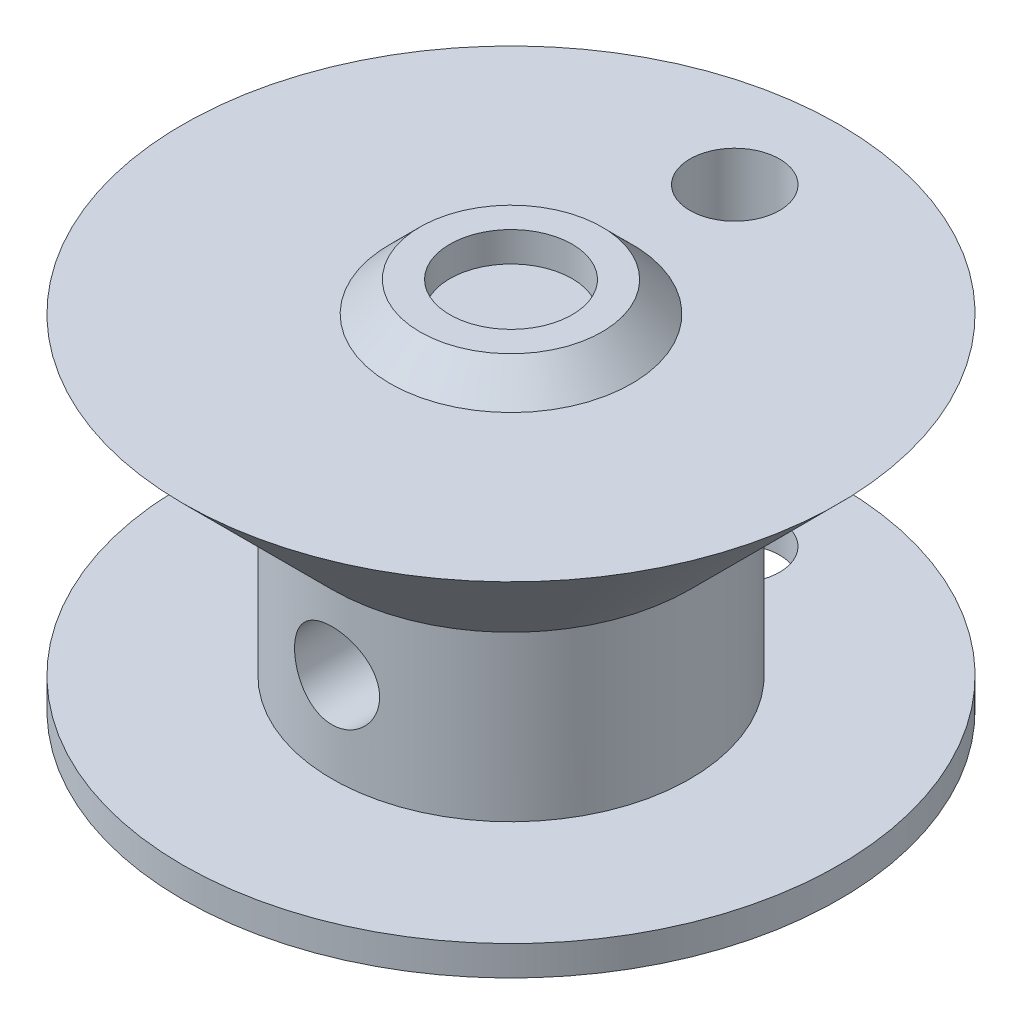
ISO-10303-21;
HEADER;
FILE_DESCRIPTION(('STEP AP214'),'2;1');
FILE_NAME('part.step','',(''),(''),'','','');
FILE_SCHEMA(('AUTOMOTIVE_DESIGN { 1 0 10303 214 1 1 1 1 }'));
ENDSEC;
DATA;
#1=APPLICATION_CONTEXT('core data for automotive mechanical design processes');
#2=APPLICATION_PROTOCOL_DEFINITION('international standard','automotive_design',2000,#1);
#3=PRODUCT_CONTEXT('',#1,'mechanical');
#4=PRODUCT('Part','Part','',(#3));
#5=PRODUCT_RELATED_PRODUCT_CATEGORY('part','',(#4));
#6=PRODUCT_DEFINITION_FORMATION('','',#4);
#7=PRODUCT_DEFINITION_CONTEXT('part definition',#1,'design');
#8=PRODUCT_DEFINITION('design','',#6,#7);
#9=PRODUCT_DEFINITION_SHAPE('','',#8);
#10=(LENGTH_UNIT() NAMED_UNIT(*) SI_UNIT(.MILLI.,.METRE.));
#11=(NAMED_UNIT(*) PLANE_ANGLE_UNIT() SI_UNIT($,.RADIAN.));
#12=(NAMED_UNIT(*) SI_UNIT($,.STERADIAN.) SOLID_ANGLE_UNIT());
#13=UNCERTAINTY_MEASURE_WITH_UNIT(LENGTH_MEASURE(1.E-05),#10,'distance_accuracy_value','');
#14=(GEOMETRIC_REPRESENTATION_CONTEXT(3) GLOBAL_UNCERTAINTY_ASSIGNED_CONTEXT((#13)) GLOBAL_UNIT_ASSIGNED_CONTEXT((#10,
#11,#12)) REPRESENTATION_CONTEXT('',''));
#15=CARTESIAN_POINT('',(0.,0.,0.));
#16=DIRECTION('',(0.,0.,1.));
#17=DIRECTION('',(1.,0.,0.));
#18=AXIS2_PLACEMENT_3D('',#15,#16,#17);
#19=CARTESIAN_POINT('',(0.,-6.24999999999999,-7.5));
#20=DIRECTION('',(0.,1.,0.));
#21=DIRECTION('',(0.,0.,1.));
#22=AXIS2_PLACEMENT_3D('',#19,#20,#21);
#23=CYLINDRICAL_SURFACE('',#22,1.5);
#24=CARTESIAN_POINT('',(-1.26870488081761,2.64664434459369,-8.30024241663984));
#25=CARTESIAN_POINT('',(-1.32275027709685,2.57010996980888,-8.21456014107575));
#26=CARTESIAN_POINT('',(-1.36661427123205,2.48977946235469,-8.12580957644183));
#27=CARTESIAN_POINT('',(-1.43556861508778,2.32402530976454,-7.94553128783668));
#28=CARTESIAN_POINT('',(-1.46059999942973,2.23858656453833,-7.85399576719215));
#29=CARTESIAN_POINT('',(-1.4942810386583,2.05861159078597,-7.66438540690111));
#30=CARTESIAN_POINT('',(-1.50167214520486,1.96385565336773,-7.56629794717566));
#31=CARTESIAN_POINT('',(-1.49769646010133,1.77273200649526,-7.3721555025522));
#32=CARTESIAN_POINT('',(-1.48632198870708,1.67636365314342,-7.27610136607951));
#33=CARTESIAN_POINT('',(-1.44136326275431,1.46433888128269,-7.06889285227441));
#34=CARTESIAN_POINT('',(-1.40379527360432,1.34867605065692,-6.95855631309214));
#35=CARTESIAN_POINT('',(-1.32777047678987,1.17807901911149,-6.79966708387336));
#36=CARTESIAN_POINT('',(-1.29914550908919,1.1216896886689,-6.74780083952307));
#37=CARTESIAN_POINT('',(-1.23509860279238,1.01044951460901,-6.64670646867279));
#38=CARTESIAN_POINT('',(-1.19968071728378,0.955597775823249,-6.59747679132385));
#39=CARTESIAN_POINT('',(-1.11314269170065,0.836396158386069,-6.49175541165681));
#40=CARTESIAN_POINT('',(-1.06028236538606,0.77260272152475,-6.4360401296291));
#41=CARTESIAN_POINT('',(-0.943097883099595,0.650585750642468,-6.3309198778082));
#42=CARTESIAN_POINT('',(-0.878793020079254,0.592353092367532,-6.28150452468661));
#43=CARTESIAN_POINT('',(-0.75650047127398,0.49906139896352,-6.20327962694322));
#44=CARTESIAN_POINT('',(-0.701365247613398,0.461953713029618,-6.17248189479857));
#45=CARTESIAN_POINT('',(-0.584257625424888,0.394542057447988,-6.11695102903519));
#46=CARTESIAN_POINT('',(-0.52229590340861,0.364227682326575,-6.09220861491444));
#47=CARTESIAN_POINT('',(-0.406177715874166,0.318451672621708,-6.05504634401468));
#48=CARTESIAN_POINT('',(-0.353219440265773,0.301196824578154,-6.0411197832836));
#49=CARTESIAN_POINT('',(-0.244353603841997,0.27371677596157,-6.01899816561024));
#50=CARTESIAN_POINT('',(-0.188448958504836,0.263484761763993,-6.01079755316085));
#51=CARTESIAN_POINT('',(-0.0748651752631121,0.250979092118054,-6.00078050222282));
#52=CARTESIAN_POINT('',(-0.0171782724982462,0.248747429776086,-5.99899775028552));
#53=CARTESIAN_POINT('',(0.0977377785373782,0.252604786511167,-6.00208408371304));
#54=CARTESIAN_POINT('',(0.154966861760675,0.258694967562729,-6.00695409799999));
#55=CARTESIAN_POINT('',(0.262899564481382,0.277801744155363,-6.02228762699205));
#56=CARTESIAN_POINT('',(0.313769997322339,0.290262024070495,-6.03230215641292));
#57=CARTESIAN_POINT('',(0.412591119335264,0.320800698786422,-6.05695918614998));
#58=CARTESIAN_POINT('',(0.460540538205376,0.338881517301619,-6.07160368306852));
#59=CARTESIAN_POINT('',(0.576183603502633,0.389841139847715,-6.11311502864666));
#60=CARTESIAN_POINT('',(0.641730480997539,0.4255950468706,-6.14242920835007));
#61=CARTESIAN_POINT('',(0.764696200336753,0.504329872416751,-6.20767190625326));
#62=CARTESIAN_POINT('',(0.822093248199738,0.547329520653735,-6.24361758984829));
#63=CARTESIAN_POINT('',(0.955239472676363,0.660500989413758,-6.33933204884527));
#64=CARTESIAN_POINT('',(1.02622908443823,0.733674370238583,-6.40215227306974));
#65=CARTESIAN_POINT('',(1.15248143214062,0.886157472557447,-6.53551397281261));
#66=CARTESIAN_POINT('',(1.20771609827644,0.965477830113604,-6.60606892321955));
#67=CARTESIAN_POINT('',(1.32066703459271,1.15621820068893,-6.77892475952415));
#68=CARTESIAN_POINT('',(1.372338368965,1.26906030687446,-6.88362122892944));
#69=CARTESIAN_POINT('',(1.45028301900606,1.49669745037887,-7.10010691361249));
#70=CARTESIAN_POINT('',(1.47653225675623,1.61149423453783,-7.21190274632636));
#71=CARTESIAN_POINT('',(1.50329724119972,1.8411307826445,-7.44079704281348));
#72=CARTESIAN_POINT('',(1.50355618496891,1.95595976594491,-7.55793698295949));
#73=CARTESIAN_POINT('',(1.47585473872372,2.1813717876856,-7.79293428458994));
#74=CARTESIAN_POINT('',(1.44794113029228,2.29196154950744,-7.91079013478641));
#75=CARTESIAN_POINT('',(1.37398292405552,2.47354892317547,-8.10807229801833));
#76=CARTESIAN_POINT('',(1.33573647582947,2.54658704262582,-8.1885606141519));
#77=CARTESIAN_POINT('',(1.24267891629586,2.68680728048154,-8.34498890265467));
#78=CARTESIAN_POINT('',(1.18789118773595,2.75399749387767,-8.42093511534804));
#79=CARTESIAN_POINT('',(1.0749244800556,2.86599719997671,-8.54886595865352));
#80=CARTESIAN_POINT('',(1.02018847703524,2.9124665025473,-8.60243065473446));
#81=CARTESIAN_POINT('',(0.900006044458402,2.9987046523251,-8.70253204434571));
#82=CARTESIAN_POINT('',(0.834572677964975,3.03848155320884,-8.74907717816344));
#83=CARTESIAN_POINT('',(0.706264628113122,3.10304045247604,-8.82503151356365));
#84=CARTESIAN_POINT('',(0.645037687925222,3.12923237122943,-8.85601689345599));
#85=CARTESIAN_POINT('',(0.516687085002818,3.17464488396731,-8.90991795054105));
#86=CARTESIAN_POINT('',(0.449566313374303,3.19386887246678,-8.93283755691817));
#87=CARTESIAN_POINT('',(0.310589727379184,3.22435897068271,-8.96925874250693));
#88=CARTESIAN_POINT('',(0.23870776111016,3.23557631157473,-8.98270259842404));
#89=CARTESIAN_POINT('',(0.0929264122279952,3.24909503895602,-8.99891085464588));
#90=CARTESIAN_POINT('',(0.0190279881612712,3.25140058989522,-9.00168024309219));
#91=CARTESIAN_POINT('',(-0.120436862446871,3.24717846191059,-8.99661465715342));
#92=CARTESIAN_POINT('',(-0.186073694250374,3.24154073003508,-8.98984805460495));
#93=CARTESIAN_POINT('',(-0.314933280986468,3.22331621794359,-8.968021450791));
#94=CARTESIAN_POINT('',(-0.378156286918464,3.21073016235814,-8.95296231434219));
#95=CARTESIAN_POINT('',(-0.501202552691301,3.17912231987032,-8.91526508112846));
#96=CARTESIAN_POINT('',(-0.560991786054804,3.16004596042124,-8.89256273532595));
#97=CARTESIAN_POINT('',(-0.675543082484829,3.11632287250872,-8.84074689416931));
#98=CARTESIAN_POINT('',(-0.730301092470031,3.09167170744244,-8.81162829303646));
#99=CARTESIAN_POINT('',(-0.854113962432761,3.02728270448439,-8.73595339437538));
#100=CARTESIAN_POINT('',(-0.92058303727761,2.98538673742684,-8.6869949785194));
#101=CARTESIAN_POINT('',(-1.04205317521811,2.89471695153168,-8.58193849640474));
#102=CARTESIAN_POINT('',(-1.09704935890167,2.845940221033,-8.52583740864048));
#103=CARTESIAN_POINT('',(-1.19187910226939,2.7472951277001,-8.41345191717882));
#104=CARTESIAN_POINT('',(-1.23256794247262,2.69781832375337,-8.35753305233655));
#105=CARTESIAN_POINT('',(-1.26870488081761,2.64664434459369,-8.30024241663984));
#106=B_SPLINE_CURVE_WITH_KNOTS('',3,(#24,#25,#26,#27,#28,#29,#30,#31,#32,#33,#34,#35,#36,#37,
#38,#39,#40,#41,#42,#43,#44,#45,#46,#47,#48,#49,#50,#51,#52,#53,#54,#55,#56,#57,#58,#59,#60,#61,
#62,#63,#64,#65,#66,#67,#68,#69,#70,#71,#72,#73,#74,#75,#76,#77,#78,#79,#80,#81,#82,#83,#84,#85,
#86,#87,#88,#89,#90,#91,#92,#93,#94,#95,#96,#97,#98,#99,#100,#101,#102,#103,#104,#105),
.UNSPECIFIED.,.T.,.F.,(4,2,2,2,2,2,2,2,2,2,2,2,2,2,2,2,2,2,2,2,2,2,2,2,2,2,2,2,2,2,2,2,2,2,2,2,
2,2,2,2,4),(0.,0.380592259301111,0.762371259474062,1.17066679694771,1.57912946932966,
2.06920967256334,2.3143079758544,2.55926049029338,2.85795509268234,3.15615085112281,
3.37520986109037,3.59393100423957,3.76548645441234,3.93687522357175,4.10916229002464,
4.28147341528623,4.44080457574636,4.60020453925544,4.8394823257887,5.07938839242926,
5.4366651215128,5.79457447259401,6.27919972264892,6.76428352610846,7.25415984166957,
7.74322403536123,8.08772712493193,8.43174548724646,8.69951647636424,8.96696288698869,
9.18641867477447,9.40576740775859,9.62644105837053,9.84701157644085,10.0447423446333,
10.2424524956668,10.4418679173757,10.6414426020434,10.9176638754004,11.1940023870322,
11.4484817683634),.UNSPECIFIED.);
#107=CARTESIAN_POINT('',(0.,0.249999999999945,-6.));
#108=VERTEX_POINT('',#107);
#109=EDGE_CURVE('E64',#108,#108,#106,.T.);
#110=ORIENTED_EDGE('',*,*,#109,.F.);
#111=EDGE_LOOP('',(#110));
#112=FACE_BOUND('',#111,.T.);
#113=CARTESIAN_POINT('',(0.,5.25,-7.5));
#114=DIRECTION('',(0.,1.,0.));
#115=DIRECTION('',(0.,0.,1.));
#116=AXIS2_PLACEMENT_3D('',#113,#114,#115);
#117=CIRCLE('',#116,1.5);
#118=CARTESIAN_POINT('',(0.,5.25,-6.));
#119=VERTEX_POINT('',#118);
#120=EDGE_CURVE('E123',#119,#119,#117,.F.);
#121=ORIENTED_EDGE('',*,*,#120,.F.);
#122=EDGE_LOOP('',(#121));
#123=FACE_BOUND('',#122,.T.);
#124=ADVANCED_FACE('F41',(#112,#123),#23,.F.);
#125=CARTESIAN_POINT('',(0.,5.25,0.));
#126=DIRECTION('',(0.,1.,0.));
#127=DIRECTION('',(0.,0.,1.));
#128=AXIS2_PLACEMENT_3D('',#125,#126,#127);
#129=CONICAL_SURFACE('',#128,11.,0.785398163397443);
#130=CARTESIAN_POINT('',(0.,0.249999999999945,0.));
#131=DIRECTION('',(0.,-1.,0.));
#132=DIRECTION('',(0.,0.,-1.));
#133=AXIS2_PLACEMENT_3D('',#130,#131,#132);
#134=CIRCLE('',#133,6.);
#135=EDGE_CURVE('E178',#108,#108,#134,.T.);
#136=ORIENTED_EDGE('',*,*,#135,.F.);
#137=ORIENTED_EDGE('',*,*,#109,.T.);
#138=EDGE_LOOP('',(#136,#137));
#139=FACE_BOUND('',#138,.T.);
#140=CARTESIAN_POINT('',(0.,5.24999999999999,0.));
#141=DIRECTION('',(0.,1.,0.));
#142=DIRECTION('',(0.,0.,1.));
#143=AXIS2_PLACEMENT_3D('',#140,#141,#142);
#144=CIRCLE('',#143,11.);
#145=CARTESIAN_POINT('',(0.,5.24999999999999,11.));
#146=VERTEX_POINT('',#145);
#147=EDGE_CURVE('E119',#146,#146,#144,.T.);
#148=ORIENTED_EDGE('',*,*,#147,.F.);
#149=EDGE_LOOP('',(#148));
#150=FACE_BOUND('',#149,.T.);
#151=ADVANCED_FACE('F150',(#139,#150),#129,.T.);
#152=CARTESIAN_POINT('',(0.,0.,0.));
#153=DIRECTION('',(0.,-1.,0.));
#154=DIRECTION('',(0.,0.,-1.));
#155=AXIS2_PLACEMENT_3D('',#152,#153,#154);
#156=CYLINDRICAL_SURFACE('',#155,6.);
#157=CARTESIAN_POINT('',(-1.425,-2.24999999999999,5.82832523114488));
#158=CARTESIAN_POINT('',(-1.42499754957619,-2.17117794111468,5.82832679456273));
#159=CARTESIAN_POINT('',(-1.4184378215098,-2.09232784081619,5.8299416549799));
#160=CARTESIAN_POINT('',(-1.39240856638387,-1.93688283008329,5.83621206316854));
#161=CARTESIAN_POINT('',(-1.37293077688578,-1.86028939578861,5.84086955699068));
#162=CARTESIAN_POINT('',(-1.3217239026565,-1.71162862093966,5.85266866593076));
#163=CARTESIAN_POINT('',(-1.29000964313047,-1.63955592561644,5.85980727399827));
#164=CARTESIAN_POINT('',(-1.2152741852674,-1.50174876665406,5.87576058358233));
#165=CARTESIAN_POINT('',(-1.1722527981629,-1.43601440885566,5.8845753130803));
#166=CARTESIAN_POINT('',(-1.07521152025432,-1.31144284368174,5.90308368584141));
#167=CARTESIAN_POINT('',(-1.02100856102342,-1.25275013738443,5.91279023612396));
#168=CARTESIAN_POINT('',(-0.903537466038936,-1.14519786757853,5.93187618342717));
#169=CARTESIAN_POINT('',(-0.840268545152597,-1.09633915659828,5.9412555520256));
#170=CARTESIAN_POINT('',(-0.705480224711474,-1.00925868531205,5.95877223244116));
#171=CARTESIAN_POINT('',(-0.633867502858193,-0.971177658155908,5.96689253595175));
#172=CARTESIAN_POINT('',(-0.485032922332117,-0.907646682120866,5.98082949973903));
#173=CARTESIAN_POINT('',(-0.40781180994908,-0.882195056207134,5.9866464658509));
#174=CARTESIAN_POINT('',(-0.251457394902446,-0.845104755455634,5.99523011087759));
#175=CARTESIAN_POINT('',(-0.172385244024105,-0.833221017594805,5.99805084031474));
#176=CARTESIAN_POINT('',(-0.0133227060721131,-0.822835846943137,6.00051209689845));
#177=CARTESIAN_POINT('',(0.066667556540959,-0.824332621177975,6.00015305013169));
#178=CARTESIAN_POINT('',(0.223600311847056,-0.840487129989935,5.99633589030348));
#179=CARTESIAN_POINT('',(0.300571757474747,-0.854880504697239,5.99294002981346));
#180=CARTESIAN_POINT('',(0.450974185407286,-0.895996235816391,5.98350262636849));
#181=CARTESIAN_POINT('',(0.524404989940588,-0.922719210572902,5.97746095072343));
#182=CARTESIAN_POINT('',(0.666353632274086,-0.98795764626664,5.96331349407922));
#183=CARTESIAN_POINT('',(0.7348253277587,-1.02656970991081,5.95519089927642));
#184=CARTESIAN_POINT('',(0.864411622860792,-1.11441753547486,5.93776673030385));
#185=CARTESIAN_POINT('',(0.925525053314481,-1.16365498221359,5.92846496925563));
#186=CARTESIAN_POINT('',(1.04023513517472,-1.27278244311827,5.90943134397237));
#187=CARTESIAN_POINT('',(1.0936112232232,-1.33290367000971,5.89969452491111));
#188=CARTESIAN_POINT('',(1.18956960142804,-1.46134566768673,5.88109854367104));
#189=CARTESIAN_POINT('',(1.23215148268538,-1.52966674894938,5.87223941474805));
#190=CARTESIAN_POINT('',(1.30543564121244,-1.67296989418144,5.85638589540492));
#191=CARTESIAN_POINT('',(1.33608959815281,-1.7479775692796,5.84939912478785));
#192=CARTESIAN_POINT('',(1.38428698892714,-1.90228645669022,5.8381819440304));
#193=CARTESIAN_POINT('',(1.40183292150916,-1.98158684760096,5.83395100857215));
#194=CARTESIAN_POINT('',(1.42296022511067,-2.14019707641701,5.82883355152234));
#195=CARTESIAN_POINT('',(1.42686565223275,-2.21946129707896,5.82786943727281));
#196=CARTESIAN_POINT('',(1.42148419611726,-2.37750850010429,5.82918435723626));
#197=CARTESIAN_POINT('',(1.41219839709507,-2.45629152148399,5.8314631249098));
#198=CARTESIAN_POINT('',(1.38098102911739,-2.60996807984924,5.83893313640274));
#199=CARTESIAN_POINT('',(1.35923386623355,-2.68490133676671,5.84408188006119));
#200=CARTESIAN_POINT('',(1.30391354344055,-2.83005968451581,5.85667219311371));
#201=CARTESIAN_POINT('',(1.27033909049535,-2.90028425956417,5.86411401319062));
#202=CARTESIAN_POINT('',(1.19162428403317,-3.03541705838874,5.8806182798807));
#203=CARTESIAN_POINT('',(1.14628774384152,-3.10020768330397,5.88970734012212));
#204=CARTESIAN_POINT('',(1.04558730851077,-3.22138056747636,5.90841470344032));
#205=CARTESIAN_POINT('',(0.990221933262647,-3.27776158335589,5.91803308449101));
#206=CARTESIAN_POINT('',(0.869556752398671,-3.38180463928887,5.93697533960111));
#207=CARTESIAN_POINT('',(0.804062689699717,-3.42924382919634,5.94628783859659));
#208=CARTESIAN_POINT('',(0.665848352025764,-3.51244852029105,5.96334530149905));
#209=CARTESIAN_POINT('',(0.593128441744467,-3.54821461023804,5.9710903444568));
#210=CARTESIAN_POINT('',(0.443013753404265,-3.60676367389571,5.98409303799143));
#211=CARTESIAN_POINT('',(0.365655444630001,-3.6296361755934,5.98936779679556));
#212=CARTESIAN_POINT('',(0.208052824060789,-3.66202261861977,5.99691014196913));
#213=CARTESIAN_POINT('',(0.12780901409213,-3.67153887136055,5.99917824866144));
#214=CARTESIAN_POINT('',(-0.0311844096307587,-3.67682337649029,6.00043288774065));
#215=CARTESIAN_POINT('',(-0.109922594873196,-3.67292203304504,5.99949828785367));
#216=CARTESIAN_POINT('',(-0.265587005387246,-3.65223150970749,5.99462496231744));
#217=CARTESIAN_POINT('',(-0.342513275190985,-3.63544264689798,5.99068631057949));
#218=CARTESIAN_POINT('',(-0.492061523146552,-3.5896234097291,5.98025705107414));
#219=CARTESIAN_POINT('',(-0.564701031253576,-3.56064749767687,5.9737778055015));
#220=CARTESIAN_POINT('',(-0.704127266421656,-3.49132717920489,5.95895343063428));
#221=CARTESIAN_POINT('',(-0.770913320694782,-3.45098146819677,5.95060808724345));
#222=CARTESIAN_POINT('',(-0.898322696426091,-3.35903022563571,5.93272702059266));
#223=CARTESIAN_POINT('',(-0.958778626336288,-3.30719704033408,5.92316919456891));
#224=CARTESIAN_POINT('',(-1.07024680803671,-3.19419142450456,5.90404754439496));
#225=CARTESIAN_POINT('',(-1.12125671726887,-3.13301668417025,5.89448371934548));
#226=CARTESIAN_POINT('',(-1.2132001891787,-3.00185721078929,5.87625592299568));
#227=CARTESIAN_POINT('',(-1.25395483674395,-2.93174448019415,5.86760927573776));
#228=CARTESIAN_POINT('',(-1.3230374514788,-2.78546986406481,5.85242104719916));
#229=CARTESIAN_POINT('',(-1.35137508425611,-2.7093127383286,5.84587782963499));
#230=CARTESIAN_POINT('',(-1.39024734307959,-2.5693301277111,5.83673875618309));
#231=CARTESIAN_POINT('',(-1.40325264531731,-2.50621427961283,5.83360622937949));
#232=CARTESIAN_POINT('',(-1.42062967935164,-2.37873846619256,5.82939889873367));
#233=CARTESIAN_POINT('',(-1.42500200140447,-2.31437858623168,5.82832395421006));
#234=CARTESIAN_POINT('',(-1.425,-2.24999999999999,5.82832523114488));
#235=B_SPLINE_CURVE_WITH_KNOTS('',3,(#157,#158,#159,#160,#161,#162,#163,#164,#165,#166,#167,
#168,#169,#170,#171,#172,#173,#174,#175,#176,#177,#178,#179,#180,#181,#182,#183,#184,#185,#186,
#187,#188,#189,#190,#191,#192,#193,#194,#195,#196,#197,#198,#199,#200,#201,#202,#203,#204,#205,
#206,#207,#208,#209,#210,#211,#212,#213,#214,#215,#216,#217,#218,#219,#220,#221,#222,#223,#224,
#225,#226,#227,#228,#229,#230,#231,#232,#233,#234),.UNSPECIFIED.,.T.,.F.,(4,2,2,2,2,2,2,2,2,2,2,
2,2,2,2,2,2,2,2,2,2,2,2,2,2,2,2,2,2,2,2,2,2,2,2,2,2,2,4),(0.,0.236229964319735,
0.472611168075709,0.708706876822911,0.94480652733293,1.18513185469304,1.42547800736211,
1.66883126540121,1.91215220035797,2.15100506917129,2.38982593243524,2.62386058864489,
2.85790698325742,3.09390763721001,3.32994574024993,3.57176046435215,3.81358434735197,
4.05637791239286,4.2991251825196,4.5360647730778,4.77298489018577,5.00648635867051,
5.24001336297664,5.47771857743411,5.71545890232203,5.95850886172442,6.20154656044608,
6.44287523147116,6.68416213337229,6.91955039892646,7.15493287320522,7.38927444719503,
7.62364292085647,7.86315428456029,8.10272496637271,8.34622345334995,8.58953205893179,
8.78248808248774,8.97543091275044),.UNSPECIFIED.);
#236=CARTESIAN_POINT('',(-1.425,-2.24999999999999,5.82832523114488));
#237=VERTEX_POINT('',#236);
#238=EDGE_CURVE('E124',#237,#237,#235,.T.);
#239=ORIENTED_EDGE('',*,*,#238,.T.);
#240=EDGE_LOOP('',(#239));
#241=FACE_BOUND('',#240,.T.);
#242=ORIENTED_EDGE('',*,*,#135,.T.);
#243=EDGE_LOOP('',(#242));
#244=FACE_BOUND('',#243,.T.);
#245=CARTESIAN_POINT('',(0.,-5.25,0.));
#246=DIRECTION('',(0.,-1.,0.));
#247=DIRECTION('',(0.,0.,-1.));
#248=AXIS2_PLACEMENT_3D('',#245,#246,#247);
#249=CIRCLE('',#248,6.);
#250=CARTESIAN_POINT('',(0.,-5.25,-6.));
#251=VERTEX_POINT('',#250);
#252=EDGE_CURVE('E254',#251,#251,#249,.T.);
#253=ORIENTED_EDGE('',*,*,#252,.F.);
#254=EDGE_LOOP('',(#253));
#255=FACE_BOUND('',#254,.T.);
#256=ADVANCED_FACE('F135',(#241,#244,#255),#156,.T.);
#257=CARTESIAN_POINT('',(0.,-5.25,11.));
#258=DIRECTION('',(0.,-1.,0.));
#259=DIRECTION('',(0.,0.,-1.));
#260=AXIS2_PLACEMENT_3D('',#257,#258,#259);
#261=PLANE('',#260);
#262=CARTESIAN_POINT('',(0.,-5.25,0.));
#263=DIRECTION('',(0.,-1.,0.));
#264=DIRECTION('',(0.,0.,-1.));
#265=AXIS2_PLACEMENT_3D('',#262,#263,#264);
#266=CIRCLE('',#265,11.);
#267=CARTESIAN_POINT('',(0.,-5.25,-11.));
#268=VERTEX_POINT('',#267);
#269=EDGE_CURVE('E250',#268,#268,#266,.T.);
#270=ORIENTED_EDGE('',*,*,#269,.F.);
#271=EDGE_LOOP('',(#270));
#272=FACE_BOUND('',#271,.T.);
#273=ORIENTED_EDGE('',*,*,#252,.T.);
#274=CARTESIAN_POINT('',(0.,-5.25,-7.5));
#275=DIRECTION('',(0.,-1.,0.));
#276=DIRECTION('',(0.,0.,-1.));
#277=AXIS2_PLACEMENT_3D('',#274,#275,#276);
#278=CIRCLE('',#277,1.5);
#279=EDGE_CURVE('E161',#251,#251,#278,.T.);
#280=ORIENTED_EDGE('',*,*,#279,.T.);
#281=EDGE_LOOP('',(#273,#280));
#282=FACE_BOUND('',#281,.T.);
#283=ADVANCED_FACE('F173',(#272,#282),#261,.F.);
#284=CARTESIAN_POINT('',(0.,0.,0.));
#285=DIRECTION('',(0.,-1.,0.));
#286=DIRECTION('',(0.,0.,-1.));
#287=AXIS2_PLACEMENT_3D('',#284,#285,#286);
#288=CYLINDRICAL_SURFACE('',#287,11.);
#289=CARTESIAN_POINT('',(0.,-6.24999999999999,0.));
#290=DIRECTION('',(0.,-1.,0.));
#291=DIRECTION('',(0.,0.,-1.));
#292=AXIS2_PLACEMENT_3D('',#289,#290,#291);
#293=CIRCLE('',#292,11.);
#294=CARTESIAN_POINT('',(0.,-6.24999999999999,-11.));
#295=VERTEX_POINT('',#294);
#296=EDGE_CURVE('E259',#295,#295,#293,.T.);
#297=ORIENTED_EDGE('',*,*,#296,.F.);
#298=EDGE_LOOP('',(#297));
#299=FACE_BOUND('',#298,.T.);
#300=ORIENTED_EDGE('',*,*,#269,.T.);
#301=EDGE_LOOP('',(#300));
#302=FACE_BOUND('',#301,.T.);
#303=ADVANCED_FACE('F239',(#299,#302),#288,.T.);
#304=CARTESIAN_POINT('',(0.,-6.24999999999999,2.5));
#305=DIRECTION('',(0.,1.,0.));
#306=DIRECTION('',(0.,0.,1.));
#307=AXIS2_PLACEMENT_3D('',#304,#305,#306);
#308=PLANE('',#307);
#309=DIRECTION('',(-1.,0.,0.));
#310=VECTOR('',#309,1.);
#311=CARTESIAN_POINT('',(1.56524758424989,-6.24999999999999,2.2));
#312=LINE('',#311,#310);
#313=CARTESIAN_POINT('',(1.56524758424989,-6.24999999999999,2.2));
#314=VERTEX_POINT('',#313);
#315=CARTESIAN_POINT('',(-1.56524758424989,-6.24999999999999,2.2));
#316=VERTEX_POINT('',#315);
#317=EDGE_CURVE('E101',#314,#316,#312,.T.);
#318=ORIENTED_EDGE('',*,*,#317,.F.);
#319=CARTESIAN_POINT('',(0.,-6.24999999999999,0.));
#320=DIRECTION('',(0.,-1.,0.));
#321=DIRECTION('',(0.,0.,-1.));
#322=AXIS2_PLACEMENT_3D('',#319,#320,#321);
#323=CIRCLE('',#322,2.70000000000002);
#324=EDGE_CURVE('E58',#316,#314,#323,.T.);
#325=ORIENTED_EDGE('',*,*,#324,.F.);
#326=EDGE_LOOP('',(#318,#325));
#327=FACE_BOUND('',#326,.T.);
#328=CARTESIAN_POINT('',(0.,-6.24999999999999,-7.5));
#329=DIRECTION('',(0.,1.,0.));
#330=DIRECTION('',(0.,0.,1.));
#331=AXIS2_PLACEMENT_3D('',#328,#329,#330);
#332=CIRCLE('',#331,1.5);
#333=CARTESIAN_POINT('',(0.,-6.24999999999999,-6.));
#334=VERTEX_POINT('',#333);
#335=EDGE_CURVE('E133',#334,#334,#332,.T.);
#336=ORIENTED_EDGE('',*,*,#335,.T.);
#337=EDGE_LOOP('',(#336));
#338=FACE_BOUND('',#337,.T.);
#339=ORIENTED_EDGE('',*,*,#296,.T.);
#340=EDGE_LOOP('',(#339));
#341=FACE_BOUND('',#340,.T.);
#342=ADVANCED_FACE('F236',(#327,#338,#341),#308,.F.);
#343=ORIENTED_EDGE('',*,*,#335,.F.);
#344=EDGE_LOOP('',(#343));
#345=FACE_BOUND('',#344,.T.);
#346=ORIENTED_EDGE('',*,*,#279,.F.);
#347=EDGE_LOOP('',(#346));
#348=FACE_BOUND('',#347,.T.);
#349=ADVANCED_FACE('F144',(#345,#348),#23,.F.);
#350=CARTESIAN_POINT('',(0.,-2.24999999999999,11.));
#351=DIRECTION('',(0.,0.,-1.));
#352=DIRECTION('',(-1.,0.,0.));
#353=AXIS2_PLACEMENT_3D('',#350,#351,#352);
#354=CYLINDRICAL_SURFACE('',#353,1.425);
#355=CARTESIAN_POINT('',(0.,-2.24999999999999,2.2));
#356=DIRECTION('',(0.,0.,1.));
#357=DIRECTION('',(1.,0.,0.));
#358=AXIS2_PLACEMENT_3D('',#355,#356,#357);
#359=CIRCLE('',#358,1.425);
#360=CARTESIAN_POINT('',(1.425,-2.24999999999999,2.2));
#361=VERTEX_POINT('',#360);
#362=EDGE_CURVE('E113',#361,#361,#359,.F.);
#363=ORIENTED_EDGE('',*,*,#362,.T.);
#364=EDGE_LOOP('',(#363));
#365=FACE_BOUND('',#364,.T.);
#366=ORIENTED_EDGE('',*,*,#238,.F.);
#367=EDGE_LOOP('',(#366));
#368=FACE_BOUND('',#367,.T.);
#369=ADVANCED_FACE('F138',(#365,#368),#354,.F.);
#370=CARTESIAN_POINT('',(0.,5.24999999999999,0.));
#371=DIRECTION('',(0.,1.,0.));
#372=DIRECTION('',(0.,0.,1.));
#373=AXIS2_PLACEMENT_3D('',#370,#371,#372);
#374=PLANE('',#373);
#375=CARTESIAN_POINT('',(0.,5.24999999999999,0.));
#376=DIRECTION('',(0.,1.,0.));
#377=DIRECTION('',(0.,0.,1.));
#378=AXIS2_PLACEMENT_3D('',#375,#376,#377);
#379=CIRCLE('',#378,4.05000000000001);
#380=CARTESIAN_POINT('',(0.,5.24999999999999,4.05000000000001));
#381=VERTEX_POINT('',#380);
#382=EDGE_CURVE('E51',#381,#381,#379,.F.);
#383=ORIENTED_EDGE('',*,*,#382,.T.);
#384=EDGE_LOOP('',(#383));
#385=FACE_BOUND('',#384,.T.);
#386=ORIENTED_EDGE('',*,*,#147,.T.);
#387=EDGE_LOOP('',(#386));
#388=FACE_BOUND('',#387,.T.);
#389=ORIENTED_EDGE('',*,*,#120,.T.);
#390=EDGE_LOOP('',(#389));
#391=FACE_BOUND('',#390,.T.);
#392=ADVANCED_FACE('F143',(#385,#388,#391),#374,.T.);
#393=CARTESIAN_POINT('',(0.,5.24999999999999,2.05));
#394=DIRECTION('',(0.,-1.,0.));
#395=DIRECTION('',(0.,0.,-1.));
#396=AXIS2_PLACEMENT_3D('',#393,#394,#395);
#397=PLANE('',#396);
#398=CARTESIAN_POINT('',(0.,5.24999999999999,0.));
#399=DIRECTION('',(0.,-1.,0.));
#400=DIRECTION('',(0.,0.,-1.));
#401=AXIS2_PLACEMENT_3D('',#398,#399,#400);
#402=CIRCLE('',#401,2.05);
#403=CARTESIAN_POINT('',(0.,5.24999999999999,-2.05));
#404=VERTEX_POINT('',#403);
#405=EDGE_CURVE('E269',#404,#404,#402,.T.);
#406=ORIENTED_EDGE('',*,*,#405,.F.);
#407=EDGE_LOOP('',(#406));
#408=FACE_BOUND('',#407,.T.);
#409=ADVANCED_FACE('F183',(#408),#397,.F.);
#410=CARTESIAN_POINT('',(0.,0.,0.));
#411=DIRECTION('',(0.,-1.,0.));
#412=DIRECTION('',(0.,0.,-1.));
#413=AXIS2_PLACEMENT_3D('',#410,#411,#412);
#414=CYLINDRICAL_SURFACE('',#413,2.05);
#415=CARTESIAN_POINT('',(0.,6.24999999999999,0.));
#416=DIRECTION('',(0.,-1.,0.));
#417=DIRECTION('',(0.,0.,-1.));
#418=AXIS2_PLACEMENT_3D('',#415,#416,#417);
#419=CIRCLE('',#418,2.05);
#420=CARTESIAN_POINT('',(0.,6.24999999999999,-2.05));
#421=VERTEX_POINT('',#420);
#422=EDGE_CURVE('E272',#421,#421,#419,.T.);
#423=ORIENTED_EDGE('',*,*,#422,.F.);
#424=EDGE_LOOP('',(#423));
#425=FACE_BOUND('',#424,.T.);
#426=ORIENTED_EDGE('',*,*,#405,.T.);
#427=EDGE_LOOP('',(#426));
#428=FACE_BOUND('',#427,.T.);
#429=ADVANCED_FACE('F214',(#425,#428),#414,.F.);
#430=CARTESIAN_POINT('',(0.,6.24999999999999,2.05));
#431=DIRECTION('',(0.,-1.,0.));
#432=DIRECTION('',(0.,0.,-1.));
#433=AXIS2_PLACEMENT_3D('',#430,#431,#432);
#434=PLANE('',#433);
#435=ORIENTED_EDGE('',*,*,#422,.T.);
#436=EDGE_LOOP('',(#435));
#437=FACE_BOUND('',#436,.T.);
#438=CARTESIAN_POINT('',(0.,6.24999999999999,0.));
#439=DIRECTION('',(0.,1.,0.));
#440=DIRECTION('',(0.,0.,1.));
#441=AXIS2_PLACEMENT_3D('',#438,#439,#440);
#442=CIRCLE('',#441,3.05);
#443=CARTESIAN_POINT('',(0.,6.24999999999999,3.05));
#444=VERTEX_POINT('',#443);
#445=EDGE_CURVE('E115',#444,#444,#442,.T.);
#446=ORIENTED_EDGE('',*,*,#445,.T.);
#447=EDGE_LOOP('',(#446));
#448=FACE_BOUND('',#447,.T.);
#449=ADVANCED_FACE('F209',(#437,#448),#434,.F.);
#450=CARTESIAN_POINT('',(0.,6.25000000000001,0.));
#451=DIRECTION('',(0.,-1.,0.));
#452=DIRECTION('',(0.,0.,-1.));
#453=AXIS2_PLACEMENT_3D('',#450,#451,#452);
#454=CONICAL_SURFACE('',#453,3.05,0.785398163397443);
#455=ORIENTED_EDGE('',*,*,#382,.F.);
#456=EDGE_LOOP('',(#455));
#457=FACE_BOUND('',#456,.T.);
#458=ORIENTED_EDGE('',*,*,#445,.F.);
#459=EDGE_LOOP('',(#458));
#460=FACE_BOUND('',#459,.T.);
#461=ADVANCED_FACE('F44',(#457,#460),#454,.T.);
#462=CARTESIAN_POINT('',(0.,1.75000000000001,0.));
#463=DIRECTION('',(0.,-1.,0.));
#464=DIRECTION('',(0.,0.,-1.));
#465=AXIS2_PLACEMENT_3D('',#462,#463,#464);
#466=PLANE('',#465);
#467=CARTESIAN_POINT('',(0.,1.75000000000001,0.));
#468=DIRECTION('',(0.,-1.,0.));
#469=DIRECTION('',(0.,0.,-1.));
#470=AXIS2_PLACEMENT_3D('',#467,#468,#469);
#471=CIRCLE('',#470,2.70000000000002);
#472=CARTESIAN_POINT('',(-1.56524758424989,1.75000000000001,2.2));
#473=VERTEX_POINT('',#472);
#474=CARTESIAN_POINT('',(1.56524758424989,1.75000000000001,2.2));
#475=VERTEX_POINT('',#474);
#476=EDGE_CURVE('E87',#473,#475,#471,.T.);
#477=ORIENTED_EDGE('',*,*,#476,.T.);
#478=DIRECTION('',(-1.,0.,0.));
#479=VECTOR('',#478,1.);
#480=CARTESIAN_POINT('',(1.56524758424989,1.75000000000001,2.2));
#481=LINE('',#480,#479);
#482=EDGE_CURVE('E95',#475,#473,#481,.T.);
#483=ORIENTED_EDGE('',*,*,#482,.T.);
#484=EDGE_LOOP('',(#477,#483));
#485=FACE_BOUND('',#484,.T.);
#486=CARTESIAN_POINT('',(0.,1.75000000000001,0.));
#487=DIRECTION('',(0.,-1.,0.));
#488=DIRECTION('',(0.,0.,-1.));
#489=AXIS2_PLACEMENT_3D('',#486,#487,#488);
#490=CIRCLE('',#489,2.5);
#491=CARTESIAN_POINT('',(-1.5,1.75000000000001,2.));
#492=VERTEX_POINT('',#491);
#493=CARTESIAN_POINT('',(1.5,1.75000000000001,2.));
#494=VERTEX_POINT('',#493);
#495=EDGE_CURVE('E265',#492,#494,#490,.T.);
#496=ORIENTED_EDGE('',*,*,#495,.F.);
#497=DIRECTION('',(-1.,0.,0.));
#498=VECTOR('',#497,1.);
#499=CARTESIAN_POINT('',(1.5,1.75000000000001,2.));
#500=LINE('',#499,#498);
#501=EDGE_CURVE('E11',#494,#492,#500,.T.);
#502=ORIENTED_EDGE('',*,*,#501,.F.);
#503=EDGE_LOOP('',(#496,#502));
#504=FACE_BOUND('',#503,.T.);
#505=ADVANCED_FACE('F98',(#485,#504),#466,.T.);
#506=CARTESIAN_POINT('',(1.56524758424989,1.75000000000001,2.2));
#507=DIRECTION('',(0.,0.,1.));
#508=DIRECTION('',(1.,0.,0.));
#509=AXIS2_PLACEMENT_3D('',#506,#507,#508);
#510=PLANE('',#509);
#511=ORIENTED_EDGE('',*,*,#317,.T.);
#512=DIRECTION('',(0.,-1.,0.));
#513=VECTOR('',#512,1.);
#514=CARTESIAN_POINT('',(-1.56524758424989,1.75000000000001,2.2));
#515=LINE('',#514,#513);
#516=EDGE_CURVE('E94',#473,#316,#515,.T.);
#517=ORIENTED_EDGE('',*,*,#516,.F.);
#518=ORIENTED_EDGE('',*,*,#482,.F.);
#519=DIRECTION('',(0.,-1.,0.));
#520=VECTOR('',#519,1.);
#521=CARTESIAN_POINT('',(1.56524758424989,1.75000000000001,2.2));
#522=LINE('',#521,#520);
#523=EDGE_CURVE('E84',#475,#314,#522,.T.);
#524=ORIENTED_EDGE('',*,*,#523,.T.);
#525=EDGE_LOOP('',(#511,#517,#518,#524));
#526=FACE_BOUND('',#525,.T.);
#527=ORIENTED_EDGE('',*,*,#362,.F.);
#528=EDGE_LOOP('',(#527));
#529=FACE_BOUND('',#528,.T.);
#530=ADVANCED_FACE('F103',(#526,#529),#510,.F.);
#531=CARTESIAN_POINT('',(0.,1.75000000000001,0.));
#532=DIRECTION('',(0.,-1.,0.));
#533=DIRECTION('',(0.,0.,-1.));
#534=AXIS2_PLACEMENT_3D('',#531,#532,#533);
#535=CYLINDRICAL_SURFACE('',#534,2.70000000000002);
#536=ORIENTED_EDGE('',*,*,#324,.T.);
#537=ORIENTED_EDGE('',*,*,#523,.F.);
#538=ORIENTED_EDGE('',*,*,#476,.F.);
#539=ORIENTED_EDGE('',*,*,#516,.T.);
#540=EDGE_LOOP('',(#536,#537,#538,#539));
#541=FACE_BOUND('',#540,.T.);
#542=ADVANCED_FACE('F86',(#541),#535,.F.);
#543=CARTESIAN_POINT('',(1.5,6.25199999999999,2.));
#544=DIRECTION('',(0.,0.,-1.));
#545=DIRECTION('',(-1.,0.,0.));
#546=AXIS2_PLACEMENT_3D('',#543,#544,#545);
#547=PLANE('',#546);
#548=CARTESIAN_POINT('',(-5.40532483795333,-1.51346567646542,2.));
#549=CARTESIAN_POINT('',(-5.23703845579857,-1.35568137601737,2.));
#550=CARTESIAN_POINT('',(-5.06834913527522,-1.19832140355245,2.));
#551=CARTESIAN_POINT('',(-4.72969693544207,-0.884764471359716,2.));
#552=CARTESIAN_POINT('',(-4.5597333221209,-0.728568305018898,2.));
#553=CARTESIAN_POINT('',(-4.21444045781616,-0.414362970691346,2.));
#554=CARTESIAN_POINT('',(-4.0390764399467,-0.256391891958179,2.));
#555=CARTESIAN_POINT('',(-3.68621418776752,0.0569599985743971,2.));
#556=CARTESIAN_POINT('',(-3.50871715480666,0.212342160695489,2.));
#557=CARTESIAN_POINT('',(-3.15059930877672,0.519357135366878,2.));
#558=CARTESIAN_POINT('',(-2.96997972489379,0.6709913686316,2.));
#559=CARTESIAN_POINT('',(-2.69528520546223,0.894147210978547,2.));
#560=CARTESIAN_POINT('',(-2.60300939278855,0.967880005591349,2.));
#561=CARTESIAN_POINT('',(-2.41694300987628,1.11340344616164,2.));
#562=CARTESIAN_POINT('',(-2.32315254399129,1.18519422501236,2.));
#563=CARTESIAN_POINT('',(-2.13448423295537,1.32560504704198,2.));
#564=CARTESIAN_POINT('',(-2.03962295015756,1.39424724400511,2.));
#565=CARTESIAN_POINT('',(-1.84748083194454,1.52815687547879,2.));
#566=CARTESIAN_POINT('',(-1.75019919212114,1.59342316520047,2.));
#567=CARTESIAN_POINT('',(-1.55290266531047,1.71904544984579,2.));
#568=CARTESIAN_POINT('',(-1.452896880785,1.77941562527908,2.));
#569=CARTESIAN_POINT('',(-1.24916457993814,1.8934593366459,2.));
#570=CARTESIAN_POINT('',(-1.14544141530789,1.94713871887606,2.));
#571=CARTESIAN_POINT('',(-0.977858701182634,2.02441408128217,2.));
#572=CARTESIAN_POINT('',(-0.915475344691583,2.05120071118133,2.));
#573=CARTESIAN_POINT('',(-0.789098880445718,2.10074532396879,2.));
#574=CARTESIAN_POINT('',(-0.725105548150873,2.1235027413137,2.));
#575=CARTESIAN_POINT('',(-0.595921759582079,2.1640023943792,2.));
#576=CARTESIAN_POINT('',(-0.530739949486013,2.18177184068901,2.));
#577=CARTESIAN_POINT('',(-0.399083851768167,2.21157839376578,2.));
#578=CARTESIAN_POINT('',(-0.332610082696303,2.22361775289139,2.));
#579=CARTESIAN_POINT('',(-0.197778787739907,2.24137152785094,2.));
#580=CARTESIAN_POINT('',(-0.129407982753557,2.24698722602039,2.));
#581=CARTESIAN_POINT('',(0.00754486580808718,2.25115687715715,2.));
#582=CARTESIAN_POINT('',(0.0761268841865436,2.24971164215697,2.));
#583=CARTESIAN_POINT('',(0.212997378424078,2.23985287322256,2.));
#584=CARTESIAN_POINT('',(0.281284232664293,2.23141724600897,2.));
#585=CARTESIAN_POINT('',(0.416753054802371,2.20813252654118,2.));
#586=CARTESIAN_POINT('',(0.483934662432339,2.1932813844505,2.));
#587=CARTESIAN_POINT('',(0.637905670819094,2.15243037460521,2.));
#588=CARTESIAN_POINT('',(0.724149036400318,2.12438793527408,2.));
#589=CARTESIAN_POINT('',(0.893791678433639,2.06078505419054,2.));
#590=CARTESIAN_POINT('',(0.977189453659802,2.02522071326481,2.));
#591=CARTESIAN_POINT('',(1.14225508434644,1.94796535257937,2.));
#592=CARTESIAN_POINT('',(1.22389132855293,1.90620758400553,2.));
#593=CARTESIAN_POINT('',(1.34451873249015,1.84031095365619,2.));
#594=CARTESIAN_POINT('',(1.38441875333737,1.81780494071996,2.));
#595=CARTESIAN_POINT('',(1.46366463509968,1.77184079644134,2.));
#596=CARTESIAN_POINT('',(1.50301052377909,1.74838271303188,2.));
#597=CARTESIAN_POINT('',(1.63729098736073,1.6663935759612,2.));
#598=CARTESIAN_POINT('',(1.73098657331465,1.60583080934184,2.));
#599=CARTESIAN_POINT('',(1.91600616291746,1.48117038954422,2.));
#600=CARTESIAN_POINT('',(2.00732946679719,1.41707171038389,2.));
#601=CARTESIAN_POINT('',(2.18815560403261,1.28619688508531,2.));
#602=CARTESIAN_POINT('',(2.27765671773994,1.21941837178679,2.));
#603=CARTESIAN_POINT('',(2.45513596362347,1.08386261199241,2.));
#604=CARTESIAN_POINT('',(2.54311397916662,1.01508521350036,2.));
#605=CARTESIAN_POINT('',(2.80593871205878,0.805885175141015,2.));
#606=CARTESIAN_POINT('',(2.97893593043844,0.663142554801017,2.));
#607=CARTESIAN_POINT('',(3.32154847121635,0.373875226087857,2.));
#608=CARTESIAN_POINT('',(3.49116554277015,0.227352568892536,2.));
#609=CARTESIAN_POINT('',(3.80827747229745,-0.0509199365617128,2.));
#610=CARTESIAN_POINT('',(3.95602735203803,-0.18237982195497,2.));
#611=CARTESIAN_POINT('',(4.25020282782233,-0.446815858055555,2.));
#612=CARTESIAN_POINT('',(4.39662821343291,-0.57979224236936,2.));
#613=CARTESIAN_POINT('',(4.68722615026315,-0.845751069519514,2.));
#614=CARTESIAN_POINT('',(4.83140729851053,-0.978724133538052,2.));
#615=CARTESIAN_POINT('',(5.11893392047399,-1.24551431665919,2.));
#616=CARTESIAN_POINT('',(5.26227955384147,-1.37933126360968,2.));
#617=CARTESIAN_POINT('',(5.40532483795333,-1.51346567646542,2.));
#618=B_SPLINE_CURVE_WITH_KNOTS('',3,(#548,#549,#550,#551,#552,#553,#554,#555,#556,#557,#558,
#559,#560,#561,#562,#563,#564,#565,#566,#567,#568,#569,#570,#571,#572,#573,#574,#575,#576,#577,
#578,#579,#580,#581,#582,#583,#584,#585,#586,#587,#588,#589,#590,#591,#592,#593,#594,#595,#596,
#597,#598,#599,#600,#601,#602,#603,#604,#605,#606,#607,#608,#609,#610,#611,#612,#613,#614,#615,
#616,#617),.UNSPECIFIED.,.F.,.F.,(4,2,2,2,2,2,2,2,2,2,2,2,2,2,2,2,2,2,2,2,2,2,2,2,2,2,2,2,2,2,2,
2,2,2,4),(0.,0.692063731971089,1.38456256553363,2.09261703407474,2.80028984319852,
3.50769015025835,3.86201887374481,4.21632328866341,4.56754484436163,4.91888473074928,
5.26916771859442,5.61914245716854,5.82270639703524,6.0262988866807,6.22875813259255,
6.43113773081285,6.63658735706346,6.84201335643012,7.04809109625687,7.25423472923198,
7.5258216640283,7.79754972954882,8.07245368153609,8.20987309218631,8.34728559288337,
8.68185318938733,9.01651838010739,9.35148599222088,9.68647914242112,10.3592262753145,
11.0316157277798,11.6249024112356,12.2182817553142,12.8066912734806,13.3949844072286),.UNSPECIFIED.);
#619=EDGE_CURVE('E160',#492,#494,#618,.T.);
#620=ORIENTED_EDGE('',*,*,#619,.T.);
#621=ORIENTED_EDGE('',*,*,#501,.T.);
#622=EDGE_LOOP('',(#620,#621));
#623=FACE_BOUND('',#622,.T.);
#624=ADVANCED_FACE('F151',(#623),#547,.T.);
#625=CARTESIAN_POINT('',(0.,1.75000000000001,0.));
#626=DIRECTION('',(0.,-1.,0.));
#627=DIRECTION('',(0.,0.,-1.));
#628=AXIS2_PLACEMENT_3D('',#625,#626,#627);
#629=CONICAL_SURFACE('',#628,2.5,0.78539816339745);
#630=CARTESIAN_POINT('',(0.,4.25,0.));
#631=VERTEX_POINT('',#630);
#632=VERTEX_LOOP('',#631);
#633=FACE_BOUND('',#632,.T.);
#634=ORIENTED_EDGE('',*,*,#495,.T.);
#635=ORIENTED_EDGE('',*,*,#619,.F.);
#636=EDGE_LOOP('',(#634,#635));
#637=FACE_BOUND('',#636,.T.);
#638=ADVANCED_FACE('F232',(#633,#637),#629,.F.);
#639=CLOSED_SHELL('',(#124,#151,#256,#283,#303,#342,#349,#369,#392,#409,#429,#449,#461,#505,
#530,#542,#624,#638));
#640=MANIFOLD_SOLID_BREP('B2',#639);
#641=ADVANCED_BREP_SHAPE_REPRESENTATION('',(#18,#640),#14);
#642=SHAPE_DEFINITION_REPRESENTATION(#9,#641);
ENDSEC;
END-ISO-10303-21;
